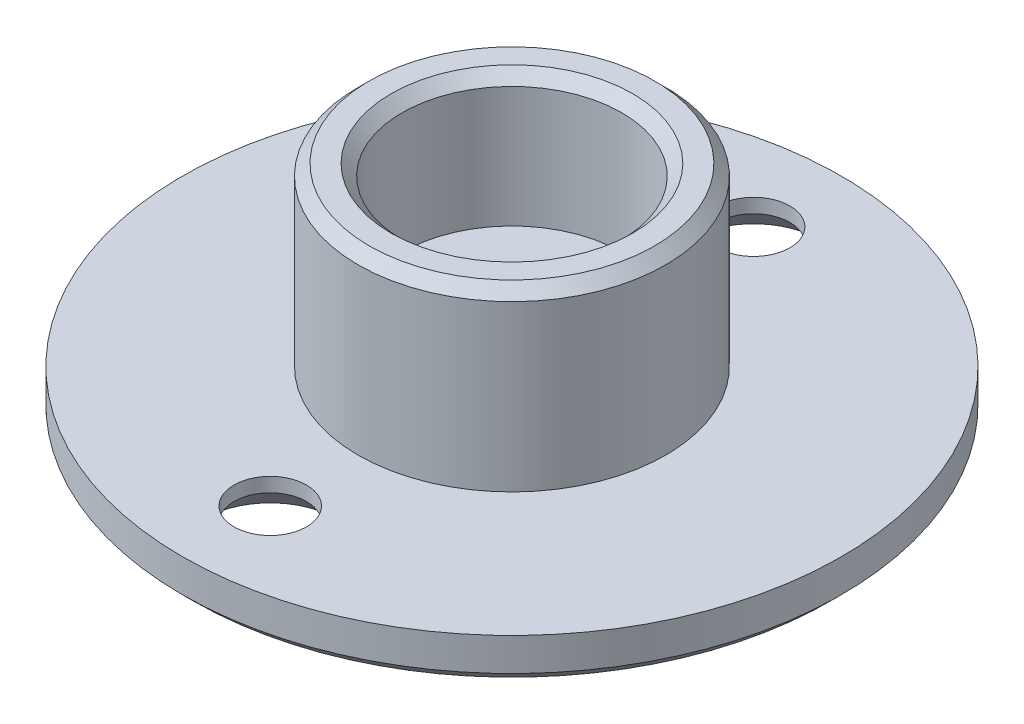
ISO-10303-21;
HEADER;
FILE_DESCRIPTION(('STEP AP214'),'2;1');
FILE_NAME('part.step','',(''),(''),'','','');
FILE_SCHEMA(('AUTOMOTIVE_DESIGN { 1 0 10303 214 1 1 1 1 }'));
ENDSEC;
DATA;
#1=APPLICATION_CONTEXT('core data for automotive mechanical design processes');
#2=APPLICATION_PROTOCOL_DEFINITION('international standard','automotive_design',2000,#1);
#3=PRODUCT_CONTEXT('',#1,'mechanical');
#4=PRODUCT('Part','Part','',(#3));
#5=PRODUCT_RELATED_PRODUCT_CATEGORY('part','',(#4));
#6=PRODUCT_DEFINITION_FORMATION('','',#4);
#7=PRODUCT_DEFINITION_CONTEXT('part definition',#1,'design');
#8=PRODUCT_DEFINITION('design','',#6,#7);
#9=PRODUCT_DEFINITION_SHAPE('','',#8);
#10=(LENGTH_UNIT() NAMED_UNIT(*) SI_UNIT(.MILLI.,.METRE.));
#11=(NAMED_UNIT(*) PLANE_ANGLE_UNIT() SI_UNIT($,.RADIAN.));
#12=(NAMED_UNIT(*) SI_UNIT($,.STERADIAN.) SOLID_ANGLE_UNIT());
#13=UNCERTAINTY_MEASURE_WITH_UNIT(LENGTH_MEASURE(1.E-05),#10,'distance_accuracy_value','');
#14=(GEOMETRIC_REPRESENTATION_CONTEXT(3) GLOBAL_UNCERTAINTY_ASSIGNED_CONTEXT((#13)) GLOBAL_UNIT_ASSIGNED_CONTEXT((#10,
#11,#12)) REPRESENTATION_CONTEXT('',''));
#15=CARTESIAN_POINT('',(0.,0.,0.));
#16=DIRECTION('',(0.,0.,1.));
#17=DIRECTION('',(1.,0.,0.));
#18=AXIS2_PLACEMENT_3D('',#15,#16,#17);
#19=CARTESIAN_POINT('',(0.,2.,0.));
#20=DIRECTION('',(0.,-1.,0.));
#21=DIRECTION('',(0.,0.,-1.));
#22=AXIS2_PLACEMENT_3D('',#19,#20,#21);
#23=CYLINDRICAL_SURFACE('',#22,15.);
#24=CARTESIAN_POINT('',(0.,0.499999999999999,0.));
#25=DIRECTION('',(0.,1.,0.));
#26=DIRECTION('',(0.,0.,1.));
#27=AXIS2_PLACEMENT_3D('',#24,#25,#26);
#28=CIRCLE('',#27,15.);
#29=CARTESIAN_POINT('',(0.,0.499999999999999,15.));
#30=VERTEX_POINT('',#29);
#31=EDGE_CURVE('E65',#30,#30,#28,.T.);
#32=ORIENTED_EDGE('',*,*,#31,.T.);
#33=EDGE_LOOP('',(#32));
#34=FACE_BOUND('',#33,.T.);
#35=CARTESIAN_POINT('',(0.,2.,0.));
#36=DIRECTION('',(0.,1.,0.));
#37=DIRECTION('',(0.,0.,1.));
#38=AXIS2_PLACEMENT_3D('',#35,#36,#37);
#39=CIRCLE('',#38,15.);
#40=CARTESIAN_POINT('',(0.,2.,15.));
#41=VERTEX_POINT('',#40);
#42=EDGE_CURVE('E79',#41,#41,#39,.T.);
#43=ORIENTED_EDGE('',*,*,#42,.F.);
#44=EDGE_LOOP('',(#43));
#45=FACE_BOUND('',#44,.T.);
#46=ADVANCED_FACE('F43',(#34,#45),#23,.T.);
#47=CARTESIAN_POINT('',(0.,2.,0.));
#48=DIRECTION('',(0.,1.,0.));
#49=DIRECTION('',(0.,0.,1.));
#50=AXIS2_PLACEMENT_3D('',#47,#48,#49);
#51=PLANE('',#50);
#52=CARTESIAN_POINT('',(0.,2.,-11.));
#53=DIRECTION('',(0.,-1.,0.));
#54=DIRECTION('',(0.,0.,-1.));
#55=AXIS2_PLACEMENT_3D('',#52,#53,#54);
#56=CIRCLE('',#55,1.65);
#57=CARTESIAN_POINT('',(0.,2.,-12.65));
#58=VERTEX_POINT('',#57);
#59=EDGE_CURVE('E100',#58,#58,#56,.T.);
#60=ORIENTED_EDGE('',*,*,#59,.T.);
#61=EDGE_LOOP('',(#60));
#62=FACE_BOUND('',#61,.T.);
#63=CARTESIAN_POINT('',(0.,2.,11.));
#64=DIRECTION('',(0.,-1.,0.));
#65=DIRECTION('',(0.,0.,-1.));
#66=AXIS2_PLACEMENT_3D('',#63,#64,#65);
#67=CIRCLE('',#66,1.65);
#68=CARTESIAN_POINT('',(0.,2.,9.35));
#69=VERTEX_POINT('',#68);
#70=EDGE_CURVE('E86',#69,#69,#67,.T.);
#71=ORIENTED_EDGE('',*,*,#70,.T.);
#72=EDGE_LOOP('',(#71));
#73=FACE_BOUND('',#72,.T.);
#74=CARTESIAN_POINT('',(0.,2.,0.));
#75=DIRECTION('',(0.,1.,0.));
#76=DIRECTION('',(0.,0.,1.));
#77=AXIS2_PLACEMENT_3D('',#74,#75,#76);
#78=CIRCLE('',#77,7.);
#79=CARTESIAN_POINT('',(0.,2.,7.));
#80=VERTEX_POINT('',#79);
#81=EDGE_CURVE('E78',#80,#80,#78,.T.);
#82=ORIENTED_EDGE('',*,*,#81,.F.);
#83=EDGE_LOOP('',(#82));
#84=FACE_BOUND('',#83,.T.);
#85=ORIENTED_EDGE('',*,*,#42,.T.);
#86=EDGE_LOOP('',(#85));
#87=FACE_BOUND('',#86,.T.);
#88=ADVANCED_FACE('F114',(#62,#73,#84,#87),#51,.T.);
#89=CARTESIAN_POINT('',(0.,0.,0.));
#90=DIRECTION('',(0.,1.,0.));
#91=DIRECTION('',(0.,0.,1.));
#92=AXIS2_PLACEMENT_3D('',#89,#90,#91);
#93=PLANE('',#92);
#94=CARTESIAN_POINT('',(0.,0.,-11.));
#95=DIRECTION('',(0.,-1.,0.));
#96=DIRECTION('',(0.,0.,-1.));
#97=AXIS2_PLACEMENT_3D('',#94,#95,#96);
#98=CIRCLE('',#97,3.);
#99=CARTESIAN_POINT('',(0.,0.,-14.));
#100=VERTEX_POINT('',#99);
#101=EDGE_CURVE('E103',#100,#100,#98,.T.);
#102=ORIENTED_EDGE('',*,*,#101,.F.);
#103=EDGE_LOOP('',(#102));
#104=FACE_BOUND('',#103,.T.);
#105=CARTESIAN_POINT('',(0.,0.,11.));
#106=DIRECTION('',(0.,-1.,0.));
#107=DIRECTION('',(0.,0.,-1.));
#108=AXIS2_PLACEMENT_3D('',#105,#106,#107);
#109=CIRCLE('',#108,3.);
#110=CARTESIAN_POINT('',(0.,0.,8.));
#111=VERTEX_POINT('',#110);
#112=EDGE_CURVE('E94',#111,#111,#109,.T.);
#113=ORIENTED_EDGE('',*,*,#112,.F.);
#114=EDGE_LOOP('',(#113));
#115=FACE_BOUND('',#114,.T.);
#116=CARTESIAN_POINT('',(0.,0.,0.));
#117=DIRECTION('',(0.,1.,0.));
#118=DIRECTION('',(0.,0.,1.));
#119=AXIS2_PLACEMENT_3D('',#116,#117,#118);
#120=CIRCLE('',#119,14.5);
#121=CARTESIAN_POINT('',(0.,0.,14.5));
#122=VERTEX_POINT('',#121);
#123=EDGE_CURVE('E54',#122,#122,#120,.F.);
#124=ORIENTED_EDGE('',*,*,#123,.T.);
#125=EDGE_LOOP('',(#124));
#126=FACE_BOUND('',#125,.T.);
#127=CARTESIAN_POINT('',(0.,0.,0.));
#128=DIRECTION('',(0.,1.,0.));
#129=DIRECTION('',(0.,0.,1.));
#130=AXIS2_PLACEMENT_3D('',#127,#128,#129);
#131=CIRCLE('',#130,3.49999999999999);
#132=CARTESIAN_POINT('',(0.,0.,3.49999999999999));
#133=VERTEX_POINT('',#132);
#134=EDGE_CURVE('E56',#133,#133,#131,.T.);
#135=ORIENTED_EDGE('',*,*,#134,.T.);
#136=EDGE_LOOP('',(#135));
#137=FACE_BOUND('',#136,.T.);
#138=ADVANCED_FACE('F108',(#104,#115,#126,#137),#93,.F.);
#139=CARTESIAN_POINT('',(0.,10.,0.));
#140=DIRECTION('',(0.,-1.,0.));
#141=DIRECTION('',(0.,0.,-1.));
#142=AXIS2_PLACEMENT_3D('',#139,#140,#141);
#143=CYLINDRICAL_SURFACE('',#142,7.);
#144=CARTESIAN_POINT('',(0.,9.49999999999999,0.));
#145=DIRECTION('',(0.,1.,0.));
#146=DIRECTION('',(0.,0.,1.));
#147=AXIS2_PLACEMENT_3D('',#144,#145,#146);
#148=CIRCLE('',#147,7.);
#149=CARTESIAN_POINT('',(0.,9.49999999999999,7.));
#150=VERTEX_POINT('',#149);
#151=EDGE_CURVE('E51',#150,#150,#148,.F.);
#152=ORIENTED_EDGE('',*,*,#151,.T.);
#153=EDGE_LOOP('',(#152));
#154=FACE_BOUND('',#153,.T.);
#155=ORIENTED_EDGE('',*,*,#81,.T.);
#156=EDGE_LOOP('',(#155));
#157=FACE_BOUND('',#156,.T.);
#158=ADVANCED_FACE('F115',(#154,#157),#143,.T.);
#159=CARTESIAN_POINT('',(0.,10.,0.));
#160=DIRECTION('',(0.,1.,0.));
#161=DIRECTION('',(0.,0.,1.));
#162=AXIS2_PLACEMENT_3D('',#159,#160,#161);
#163=PLANE('',#162);
#164=CARTESIAN_POINT('',(0.,10.,0.));
#165=DIRECTION('',(0.,1.,0.));
#166=DIRECTION('',(0.,0.,1.));
#167=AXIS2_PLACEMENT_3D('',#164,#165,#166);
#168=CIRCLE('',#167,5.50000000000001);
#169=CARTESIAN_POINT('',(0.,10.,5.50000000000001));
#170=VERTEX_POINT('',#169);
#171=EDGE_CURVE('E70',#170,#170,#168,.F.);
#172=ORIENTED_EDGE('',*,*,#171,.T.);
#173=EDGE_LOOP('',(#172));
#174=FACE_BOUND('',#173,.T.);
#175=CARTESIAN_POINT('',(0.,10.,0.));
#176=DIRECTION('',(0.,1.,0.));
#177=DIRECTION('',(0.,0.,1.));
#178=AXIS2_PLACEMENT_3D('',#175,#176,#177);
#179=CIRCLE('',#178,6.49999999999998);
#180=CARTESIAN_POINT('',(0.,10.,6.49999999999998));
#181=VERTEX_POINT('',#180);
#182=EDGE_CURVE('E66',#181,#181,#179,.T.);
#183=ORIENTED_EDGE('',*,*,#182,.T.);
#184=EDGE_LOOP('',(#183));
#185=FACE_BOUND('',#184,.T.);
#186=ADVANCED_FACE('F229',(#174,#185),#163,.T.);
#187=CARTESIAN_POINT('',(0.,4.,0.));
#188=DIRECTION('',(0.,1.,0.));
#189=DIRECTION('',(0.,0.,1.));
#190=AXIS2_PLACEMENT_3D('',#187,#188,#189);
#191=CYLINDRICAL_SURFACE('',#190,5.);
#192=CARTESIAN_POINT('',(0.,9.49999999999999,0.));
#193=DIRECTION('',(0.,1.,0.));
#194=DIRECTION('',(0.,0.,1.));
#195=AXIS2_PLACEMENT_3D('',#192,#193,#194);
#196=CIRCLE('',#195,5.);
#197=CARTESIAN_POINT('',(0.,9.49999999999999,5.));
#198=VERTEX_POINT('',#197);
#199=EDGE_CURVE('E71',#198,#198,#196,.T.);
#200=ORIENTED_EDGE('',*,*,#199,.T.);
#201=EDGE_LOOP('',(#200));
#202=FACE_BOUND('',#201,.T.);
#203=CARTESIAN_POINT('',(0.,4.,0.));
#204=DIRECTION('',(0.,1.,0.));
#205=DIRECTION('',(0.,0.,1.));
#206=AXIS2_PLACEMENT_3D('',#203,#204,#205);
#207=CIRCLE('',#206,5.);
#208=CARTESIAN_POINT('',(0.,4.,5.));
#209=VERTEX_POINT('',#208);
#210=EDGE_CURVE('E76',#209,#209,#207,.T.);
#211=ORIENTED_EDGE('',*,*,#210,.F.);
#212=EDGE_LOOP('',(#211));
#213=FACE_BOUND('',#212,.T.);
#214=ADVANCED_FACE('F224',(#202,#213),#191,.F.);
#215=CARTESIAN_POINT('',(0.,4.,0.));
#216=DIRECTION('',(0.,1.,0.));
#217=DIRECTION('',(0.,0.,1.));
#218=AXIS2_PLACEMENT_3D('',#215,#216,#217);
#219=PLANE('',#218);
#220=CARTESIAN_POINT('',(0.,4.,0.));
#221=DIRECTION('',(0.,1.,0.));
#222=DIRECTION('',(0.,0.,1.));
#223=AXIS2_PLACEMENT_3D('',#220,#221,#222);
#224=CIRCLE('',#223,3.);
#225=CARTESIAN_POINT('',(0.,4.,3.));
#226=VERTEX_POINT('',#225);
#227=EDGE_CURVE('E81',#226,#226,#224,.T.);
#228=ORIENTED_EDGE('',*,*,#227,.F.);
#229=EDGE_LOOP('',(#228));
#230=FACE_BOUND('',#229,.T.);
#231=ORIENTED_EDGE('',*,*,#210,.T.);
#232=EDGE_LOOP('',(#231));
#233=FACE_BOUND('',#232,.T.);
#234=ADVANCED_FACE('F222',(#230,#233),#219,.T.);
#235=CARTESIAN_POINT('',(0.,0.,0.));
#236=DIRECTION('',(0.,1.,0.));
#237=DIRECTION('',(0.,0.,1.));
#238=AXIS2_PLACEMENT_3D('',#235,#236,#237);
#239=CYLINDRICAL_SURFACE('',#238,3.);
#240=CARTESIAN_POINT('',(0.,0.499999999999997,0.));
#241=DIRECTION('',(0.,1.,0.));
#242=DIRECTION('',(0.,0.,1.));
#243=AXIS2_PLACEMENT_3D('',#240,#241,#242);
#244=CIRCLE('',#243,3.);
#245=CARTESIAN_POINT('',(0.,0.499999999999997,3.));
#246=VERTEX_POINT('',#245);
#247=EDGE_CURVE('E10',#246,#246,#244,.F.);
#248=ORIENTED_EDGE('',*,*,#247,.T.);
#249=EDGE_LOOP('',(#248));
#250=FACE_BOUND('',#249,.T.);
#251=ORIENTED_EDGE('',*,*,#227,.T.);
#252=EDGE_LOOP('',(#251));
#253=FACE_BOUND('',#252,.T.);
#254=ADVANCED_FACE('F153',(#250,#253),#239,.F.);
#255=CARTESIAN_POINT('',(0.,9.49999999999999,0.));
#256=DIRECTION('',(0.,1.,0.));
#257=DIRECTION('',(0.,0.,1.));
#258=AXIS2_PLACEMENT_3D('',#255,#256,#257);
#259=CONICAL_SURFACE('',#258,5.,0.785398163397449);
#260=ORIENTED_EDGE('',*,*,#171,.F.);
#261=EDGE_LOOP('',(#260));
#262=FACE_BOUND('',#261,.T.);
#263=ORIENTED_EDGE('',*,*,#199,.F.);
#264=EDGE_LOOP('',(#263));
#265=FACE_BOUND('',#264,.T.);
#266=ADVANCED_FACE('F150',(#262,#265),#259,.F.);
#267=CARTESIAN_POINT('',(0.,0.499999999999999,0.));
#268=DIRECTION('',(0.,1.,0.));
#269=DIRECTION('',(0.,0.,1.));
#270=AXIS2_PLACEMENT_3D('',#267,#268,#269);
#271=CONICAL_SURFACE('',#270,15.,0.785398163397448);
#272=ORIENTED_EDGE('',*,*,#123,.F.);
#273=EDGE_LOOP('',(#272));
#274=FACE_BOUND('',#273,.T.);
#275=ORIENTED_EDGE('',*,*,#31,.F.);
#276=EDGE_LOOP('',(#275));
#277=FACE_BOUND('',#276,.T.);
#278=ADVANCED_FACE('F134',(#274,#277),#271,.T.);
#279=CARTESIAN_POINT('',(0.,10.,0.));
#280=DIRECTION('',(0.,-1.,0.));
#281=DIRECTION('',(0.,0.,-1.));
#282=AXIS2_PLACEMENT_3D('',#279,#280,#281);
#283=CONICAL_SURFACE('',#282,6.49999999999998,0.785398163397453);
#284=ORIENTED_EDGE('',*,*,#151,.F.);
#285=EDGE_LOOP('',(#284));
#286=FACE_BOUND('',#285,.T.);
#287=ORIENTED_EDGE('',*,*,#182,.F.);
#288=EDGE_LOOP('',(#287));
#289=FACE_BOUND('',#288,.T.);
#290=ADVANCED_FACE('F123',(#286,#289),#283,.T.);
#291=CARTESIAN_POINT('',(0.,0.,0.));
#292=DIRECTION('',(0.,-1.,0.));
#293=DIRECTION('',(0.,0.,-1.));
#294=AXIS2_PLACEMENT_3D('',#291,#292,#293);
#295=CONICAL_SURFACE('',#294,3.49999999999999,0.785398163397441);
#296=ORIENTED_EDGE('',*,*,#247,.F.);
#297=EDGE_LOOP('',(#296));
#298=FACE_BOUND('',#297,.T.);
#299=ORIENTED_EDGE('',*,*,#134,.F.);
#300=EDGE_LOOP('',(#299));
#301=FACE_BOUND('',#300,.T.);
#302=ADVANCED_FACE('F46',(#298,#301),#295,.F.);
#303=CARTESIAN_POINT('',(0.,0.,11.));
#304=DIRECTION('',(0.,-1.,0.));
#305=DIRECTION('',(0.,0.,-1.));
#306=AXIS2_PLACEMENT_3D('',#303,#304,#305);
#307=CYLINDRICAL_SURFACE('',#306,1.65);
#308=ORIENTED_EDGE('',*,*,#70,.F.);
#309=EDGE_LOOP('',(#308));
#310=FACE_BOUND('',#309,.T.);
#311=CARTESIAN_POINT('',(0.,1.35,11.));
#312=DIRECTION('',(0.,-1.,0.));
#313=DIRECTION('',(0.,0.,-1.));
#314=AXIS2_PLACEMENT_3D('',#311,#312,#313);
#315=CIRCLE('',#314,1.65);
#316=CARTESIAN_POINT('',(0.,1.35,9.35));
#317=VERTEX_POINT('',#316);
#318=EDGE_CURVE('E93',#317,#317,#315,.T.);
#319=ORIENTED_EDGE('',*,*,#318,.T.);
#320=EDGE_LOOP('',(#319));
#321=FACE_BOUND('',#320,.T.);
#322=ADVANCED_FACE('F125',(#310,#321),#307,.F.);
#323=CARTESIAN_POINT('',(0.,0.,11.));
#324=DIRECTION('',(0.,-1.,0.));
#325=DIRECTION('',(0.,0.,-1.));
#326=AXIS2_PLACEMENT_3D('',#323,#324,#325);
#327=CONICAL_SURFACE('',#326,3.,0.785398163397448);
#328=ORIENTED_EDGE('',*,*,#318,.F.);
#329=EDGE_LOOP('',(#328));
#330=FACE_BOUND('',#329,.T.);
#331=ORIENTED_EDGE('',*,*,#112,.T.);
#332=EDGE_LOOP('',(#331));
#333=FACE_BOUND('',#332,.T.);
#334=ADVANCED_FACE('F129',(#330,#333),#327,.F.);
#335=CARTESIAN_POINT('',(0.,0.,-11.));
#336=DIRECTION('',(0.,-1.,0.));
#337=DIRECTION('',(0.,0.,-1.));
#338=AXIS2_PLACEMENT_3D('',#335,#336,#337);
#339=CYLINDRICAL_SURFACE('',#338,1.65);
#340=ORIENTED_EDGE('',*,*,#59,.F.);
#341=EDGE_LOOP('',(#340));
#342=FACE_BOUND('',#341,.T.);
#343=CARTESIAN_POINT('',(0.,1.35,-11.));
#344=DIRECTION('',(0.,-1.,0.));
#345=DIRECTION('',(0.,0.,-1.));
#346=AXIS2_PLACEMENT_3D('',#343,#344,#345);
#347=CIRCLE('',#346,1.65);
#348=CARTESIAN_POINT('',(0.,1.35,-12.65));
#349=VERTEX_POINT('',#348);
#350=EDGE_CURVE('E99',#349,#349,#347,.T.);
#351=ORIENTED_EDGE('',*,*,#350,.T.);
#352=EDGE_LOOP('',(#351));
#353=FACE_BOUND('',#352,.T.);
#354=ADVANCED_FACE('F198',(#342,#353),#339,.F.);
#355=CARTESIAN_POINT('',(0.,0.,-11.));
#356=DIRECTION('',(0.,-1.,0.));
#357=DIRECTION('',(0.,0.,-1.));
#358=AXIS2_PLACEMENT_3D('',#355,#356,#357);
#359=CONICAL_SURFACE('',#358,3.,0.785398163397448);
#360=ORIENTED_EDGE('',*,*,#350,.F.);
#361=EDGE_LOOP('',(#360));
#362=FACE_BOUND('',#361,.T.);
#363=ORIENTED_EDGE('',*,*,#101,.T.);
#364=EDGE_LOOP('',(#363));
#365=FACE_BOUND('',#364,.T.);
#366=ADVANCED_FACE('F110',(#362,#365),#359,.F.);
#367=CLOSED_SHELL('',(#46,#88,#138,#158,#186,#214,#234,#254,#266,#278,#290,#302,#322,#334,#354,#366));
#368=MANIFOLD_SOLID_BREP('B2',#367);
#369=ADVANCED_BREP_SHAPE_REPRESENTATION('',(#18,#368),#14);
#370=SHAPE_DEFINITION_REPRESENTATION(#9,#369);
ENDSEC;
END-ISO-10303-21;
